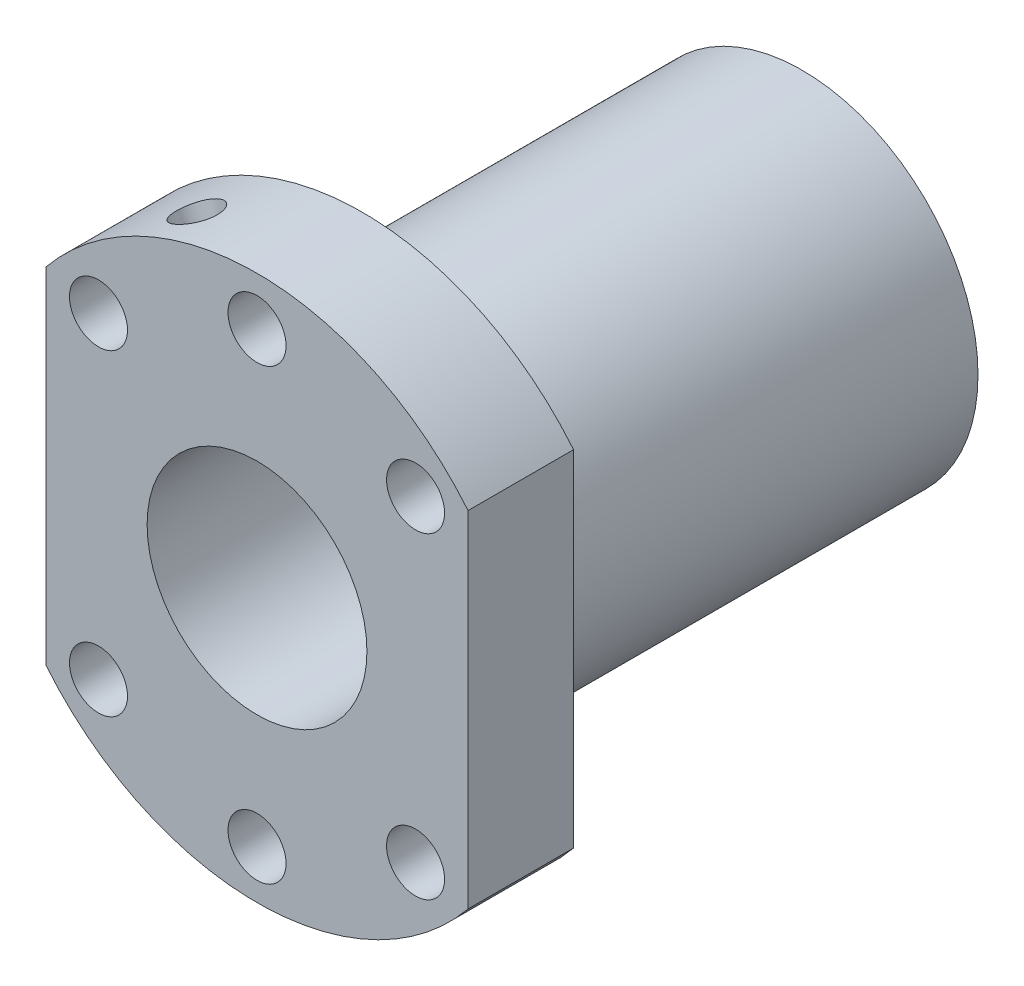
ISO-10303-21;
HEADER;
FILE_DESCRIPTION(('STEP AP214'),'2;1');
FILE_NAME('part.step','',(''),(''),'','','');
FILE_SCHEMA(('AUTOMOTIVE_DESIGN { 1 0 10303 214 1 1 1 1 }'));
ENDSEC;
DATA;
#1=APPLICATION_CONTEXT('core data for automotive mechanical design processes');
#2=APPLICATION_PROTOCOL_DEFINITION('international standard','automotive_design',2000,#1);
#3=PRODUCT_CONTEXT('',#1,'mechanical');
#4=PRODUCT('Part','Part','',(#3));
#5=PRODUCT_RELATED_PRODUCT_CATEGORY('part','',(#4));
#6=PRODUCT_DEFINITION_FORMATION('','',#4);
#7=PRODUCT_DEFINITION_CONTEXT('part definition',#1,'design');
#8=PRODUCT_DEFINITION('design','',#6,#7);
#9=PRODUCT_DEFINITION_SHAPE('','',#8);
#10=(LENGTH_UNIT() NAMED_UNIT(*) SI_UNIT(.MILLI.,.METRE.));
#11=(NAMED_UNIT(*) PLANE_ANGLE_UNIT() SI_UNIT($,.RADIAN.));
#12=(NAMED_UNIT(*) SI_UNIT($,.STERADIAN.) SOLID_ANGLE_UNIT());
#13=UNCERTAINTY_MEASURE_WITH_UNIT(LENGTH_MEASURE(1.E-05),#10,'distance_accuracy_value','');
#14=(GEOMETRIC_REPRESENTATION_CONTEXT(3) GLOBAL_UNCERTAINTY_ASSIGNED_CONTEXT((#13)) GLOBAL_UNIT_ASSIGNED_CONTEXT((#10,
#11,#12)) REPRESENTATION_CONTEXT('',''));
#15=CARTESIAN_POINT('',(0.,0.,0.));
#16=DIRECTION('',(0.,0.,1.));
#17=DIRECTION('',(1.,0.,0.));
#18=AXIS2_PLACEMENT_3D('',#15,#16,#17);
#19=CARTESIAN_POINT('',(0.,0.,12.));
#20=DIRECTION('',(0.,0.,-1.));
#21=DIRECTION('',(-1.,0.,0.));
#22=AXIS2_PLACEMENT_3D('',#19,#20,#21);
#23=CYLINDRICAL_SURFACE('',#22,31.);
#24=DIRECTION('',(0.,0.,-1.));
#25=VECTOR('',#24,1.);
#26=CARTESIAN_POINT('',(24.,-19.6214168703486,12.));
#27=LINE('',#26,#25);
#28=CARTESIAN_POINT('',(24.,-19.6214168703486,12.));
#29=VERTEX_POINT('',#28);
#30=CARTESIAN_POINT('',(24.,-19.6214168703486,0.));
#31=VERTEX_POINT('',#30);
#32=EDGE_CURVE('E35',#29,#31,#27,.T.);
#33=ORIENTED_EDGE('',*,*,#32,.F.);
#34=CARTESIAN_POINT('',(0.,0.,12.));
#35=DIRECTION('',(0.,0.,1.));
#36=DIRECTION('',(1.,0.,0.));
#37=AXIS2_PLACEMENT_3D('',#34,#35,#36);
#38=CIRCLE('',#37,31.);
#39=CARTESIAN_POINT('',(-24.,-19.6214168703486,12.));
#40=VERTEX_POINT('',#39);
#41=EDGE_CURVE('E82',#40,#29,#38,.T.);
#42=ORIENTED_EDGE('',*,*,#41,.F.);
#43=DIRECTION('',(0.,0.,-1.));
#44=VECTOR('',#43,1.);
#45=CARTESIAN_POINT('',(-24.,-19.6214168703486,12.));
#46=LINE('',#45,#44);
#47=CARTESIAN_POINT('',(-24.,-19.6214168703486,0.));
#48=VERTEX_POINT('',#47);
#49=EDGE_CURVE('E62',#48,#40,#46,.F.);
#50=ORIENTED_EDGE('',*,*,#49,.F.);
#51=CARTESIAN_POINT('',(0.,0.,0.));
#52=DIRECTION('',(0.,0.,1.));
#53=DIRECTION('',(1.,0.,0.));
#54=AXIS2_PLACEMENT_3D('',#51,#52,#53);
#55=CIRCLE('',#54,31.);
#56=EDGE_CURVE('E88',#48,#31,#55,.T.);
#57=ORIENTED_EDGE('',*,*,#56,.T.);
#58=EDGE_LOOP('',(#33,#42,#50,#57));
#59=FACE_BOUND('',#58,.T.);
#60=ADVANCED_FACE('F17',(#59),#23,.T.);
#61=CARTESIAN_POINT('',(-14.1342452713024,27.5902720285731,7.));
#62=CARTESIAN_POINT('',(-14.1342401201163,27.5902756123323,6.85981909369858));
#63=CARTESIAN_POINT('',(-14.1236846997904,27.595690019317,6.71954235921639));
#64=CARTESIAN_POINT('',(-14.0817015214886,27.6171362826384,6.44286901789629));
#65=CARTESIAN_POINT('',(-14.050250019881,27.6331802169509,6.30647700923097));
#66=CARTESIAN_POINT('',(-13.9672987475467,27.6752003512647,6.04162039436832));
#67=CARTESIAN_POINT('',(-13.9158102289747,27.701170976605,5.91315138569053));
#68=CARTESIAN_POINT('',(-13.7941280432392,27.7619638154555,5.66772065220375));
#69=CARTESIAN_POINT('',(-13.7239384161053,27.7967841170815,5.55075644945705));
#70=CARTESIAN_POINT('',(-13.5664921381212,27.8739658338832,5.3313422891408));
#71=CARTESIAN_POINT('',(-13.479199313163,27.916343215286,5.22892390273656));
#72=CARTESIAN_POINT('',(-13.2899131164381,28.0069490675099,5.04177976706672));
#73=CARTESIAN_POINT('',(-13.1879191070185,28.0551777921142,4.95705478562994));
#74=CARTESIAN_POINT('',(-12.9717778155538,28.1557664882156,4.80759831042213));
#75=CARTESIAN_POINT('',(-12.8576142864007,28.2081319577819,4.74289400666314));
#76=CARTESIAN_POINT('',(-12.6203299707633,28.3150876641874,4.63548953637274));
#77=CARTESIAN_POINT('',(-12.4972093322438,28.3696778642692,4.59278900644936));
#78=CARTESIAN_POINT('',(-12.2456856516657,28.4791492823758,4.53069472713347));
#79=CARTESIAN_POINT('',(-12.1172947878084,28.534029599499,4.51125006429122));
#80=CARTESIAN_POINT('',(-11.8585876275347,28.6425133390686,4.49606211362361));
#81=CARTESIAN_POINT('',(-11.7282713649218,28.6961167838894,4.50031841018325));
#82=CARTESIAN_POINT('',(-11.4697438954012,28.8004230081387,4.53236987047806));
#83=CARTESIAN_POINT('',(-11.3415284986412,28.8511322419225,4.5601102827327));
#84=CARTESIAN_POINT('',(-11.0905932573533,28.948520988238,4.63825741639545));
#85=CARTESIAN_POINT('',(-10.967873462302,28.9952004644934,4.68866434182462));
#86=CARTESIAN_POINT('',(-10.7313724629871,29.0835626622971,4.8107747981292));
#87=CARTESIAN_POINT('',(-10.6176017607656,29.1252395424297,4.88250289208644));
#88=CARTESIAN_POINT('',(-10.4025107097974,29.2027543518807,5.04520174999892));
#89=CARTESIAN_POINT('',(-10.3011905973662,29.2385921703764,5.13617287910315));
#90=CARTESIAN_POINT('',(-10.1137559728046,29.303956089406,5.33508414715785));
#91=CARTESIAN_POINT('',(-10.0276855668488,29.3334639322324,5.44307185388159));
#92=CARTESIAN_POINT('',(-9.87372356907663,29.3856463677654,5.67278500355847));
#93=CARTESIAN_POINT('',(-9.80583199090228,29.4083209553441,5.79451045682076));
#94=CARTESIAN_POINT('',(-9.69031972928192,29.446585960799,6.04827681879972));
#95=CARTESIAN_POINT('',(-9.64270132417015,29.4621755824679,6.18031888494275));
#96=CARTESIAN_POINT('',(-9.56924444865255,29.4861165018025,6.45095459564243));
#97=CARTESIAN_POINT('',(-9.54340554979036,29.4944679418612,6.58954811125934));
#98=CARTESIAN_POINT('',(-9.51436937092276,29.5038474158376,6.86893504254676));
#99=CARTESIAN_POINT('',(-9.51110858051684,29.5048959921714,7.00972117003471));
#100=CARTESIAN_POINT('',(-9.52716389436612,29.4997155327458,7.28986375447758));
#101=CARTESIAN_POINT('',(-9.54647980159971,29.4934865604959,7.42922022389808));
#102=CARTESIAN_POINT('',(-9.60703431751324,29.4738170655066,7.70235707234798));
#103=CARTESIAN_POINT('',(-9.6482434031063,29.4603862542652,7.83614469961913));
#104=CARTESIAN_POINT('',(-9.75127623529389,29.426442814925,8.09457053516938));
#105=CARTESIAN_POINT('',(-9.81310029199487,29.4059300802942,8.21920860577931));
#106=CARTESIAN_POINT('',(-9.95561696836713,29.357985869995,8.45610195867316));
#107=CARTESIAN_POINT('',(-10.0363512816118,29.3305390954037,8.56832906032629));
#108=CARTESIAN_POINT('',(-10.2141564349569,29.2690934737102,8.77693007887926));
#109=CARTESIAN_POINT('',(-10.3112275384941,29.2350945209504,8.87330374008704));
#110=CARTESIAN_POINT('',(-10.5190372809147,29.1609675681195,9.04768895567128));
#111=CARTESIAN_POINT('',(-10.629807167144,29.1208255040326,9.12565730422603));
#112=CARTESIAN_POINT('',(-10.8615354789183,29.0351904468265,9.26072232651106));
#113=CARTESIAN_POINT('',(-10.982493808206,28.989697504259,9.31781919740132));
#114=CARTESIAN_POINT('',(-11.2308826734606,28.8943754808371,9.40944615389299));
#115=CARTESIAN_POINT('',(-11.3583053257544,28.8445516312855,9.44400304781427));
#116=CARTESIAN_POINT('',(-11.6160383838689,28.7417273864918,9.48965674220853));
#117=CARTESIAN_POINT('',(-11.7463487388027,28.6887270471978,9.50075395575541));
#118=CARTESIAN_POINT('',(-12.0057354175071,28.5811472182681,9.49916859432798));
#119=CARTESIAN_POINT('',(-12.1348141934104,28.5265726352522,9.48655339321283));
#120=CARTESIAN_POINT('',(-12.3884784390329,28.4173306245737,9.43804168387121));
#121=CARTESIAN_POINT('',(-12.5130639023401,28.3626631967789,9.40214514242378));
#122=CARTESIAN_POINT('',(-12.7543005209139,28.2550044971574,9.30810660110948));
#123=CARTESIAN_POINT('',(-12.8709520649513,28.2020131432695,9.24996569216748));
#124=CARTESIAN_POINT('',(-13.0931834167712,28.0995291863662,9.11309669233372));
#125=CARTESIAN_POINT('',(-13.1987634157133,28.0500365229479,9.03436895697306));
#126=CARTESIAN_POINT('',(-13.3963369455363,27.9562188150339,8.858308412332));
#127=CARTESIAN_POINT('',(-13.488292942345,27.9119081149812,8.7609258393535));
#128=CARTESIAN_POINT('',(-13.6558932337324,27.8302945402111,8.55040785764802));
#129=CARTESIAN_POINT('',(-13.7315335668014,27.7929933677183,8.43726863409118));
#130=CARTESIAN_POINT('',(-13.8646285290537,27.7268394640028,8.19824268654993));
#131=CARTESIAN_POINT('',(-13.9220505495098,27.6980018885004,8.07233363147814));
#132=CARTESIAN_POINT('',(-14.0169804119122,27.6500834355439,7.81159123745397));
#133=CARTESIAN_POINT('',(-14.0545112117696,27.630991311096,7.67676838968557));
#134=CARTESIAN_POINT('',(-14.0991155194328,27.6082469797282,7.4509547811725));
#135=CARTESIAN_POINT('',(-14.1122732114442,27.6015188639259,7.36141747228279));
#136=CARTESIAN_POINT('',(-14.1298397421072,27.5925302351152,7.1812667991351));
#137=CARTESIAN_POINT('',(-14.1342486025173,27.5902697109959,7.09065343755384));
#138=CARTESIAN_POINT('',(-14.1342452713024,27.5902720285731,7.));
#139=B_SPLINE_CURVE_WITH_KNOTS('',3,(#61,#62,#63,#64,#65,#66,#67,#68,#69,#70,#71,#72,#73,#74,
#75,#76,#77,#78,#79,#80,#81,#82,#83,#84,#85,#86,#87,#88,#89,#90,#91,#92,#93,#94,#95,#96,#97,#98,
#99,#100,#101,#102,#103,#104,#105,#106,#107,#108,#109,#110,#111,#112,#113,#114,#115,#116,#117,
#118,#119,#120,#121,#122,#123,#124,#125,#126,#127,#128,#129,#130,#131,#132,#133,#134,#135,#136,
#137,#138),.UNSPECIFIED.,.T.,.F.,(4,2,2,2,2,2,2,2,2,2,2,2,2,2,2,2,2,2,2,2,2,2,2,2,2,2,2,2,2,2,2,
2,2,2,2,2,2,2,4),(0.,0.420211733760468,0.840901760810246,1.26135588177584,1.68171924492903,
2.1029814866362,2.5242620057811,2.94611217842449,3.36795538399598,3.78887335900965,
4.20978395291821,4.62971591886167,5.04965166468437,5.47007308555839,5.8905024849154,
6.3121287026456,6.73375523677673,7.15542914152699,7.57709475072284,7.99757376491254,
8.4180491097067,8.83795887477871,9.25787495674499,9.67872573792308,10.0995833061237,
10.5214192107358,10.9432511304216,11.3645804175529,11.7859022859311,12.2060288656642,
12.626156044892,13.0462626225696,13.4663619455548,13.8875979382243,14.3089360938687,
14.7310241975361,15.1526240717025,15.424371015779,15.6961172840185),.UNSPECIFIED.);
#140=CARTESIAN_POINT('',(-14.1342452713024,27.5902720285731,7.));
#141=VERTEX_POINT('',#140);
#142=EDGE_CURVE('E11',#141,#141,#139,.T.);
#143=ORIENTED_EDGE('',*,*,#142,.T.);
#144=EDGE_LOOP('',(#143));
#145=FACE_BOUND('',#144,.T.);
#146=DIRECTION('',(0.,0.,-1.));
#147=VECTOR('',#146,1.);
#148=CARTESIAN_POINT('',(24.,19.6214168703486,12.));
#149=LINE('',#148,#147);
#150=CARTESIAN_POINT('',(24.,19.6214168703486,0.));
#151=VERTEX_POINT('',#150);
#152=CARTESIAN_POINT('',(24.,19.6214168703486,12.));
#153=VERTEX_POINT('',#152);
#154=EDGE_CURVE('E77',#151,#153,#149,.F.);
#155=ORIENTED_EDGE('',*,*,#154,.F.);
#156=CARTESIAN_POINT('',(-24.,19.6214168703486,0.));
#157=VERTEX_POINT('',#156);
#158=EDGE_CURVE('E76',#151,#157,#55,.T.);
#159=ORIENTED_EDGE('',*,*,#158,.T.);
#160=DIRECTION('',(0.,0.,-1.));
#161=VECTOR('',#160,1.);
#162=CARTESIAN_POINT('',(-24.,19.6214168703486,12.));
#163=LINE('',#162,#161);
#164=CARTESIAN_POINT('',(-24.,19.6214168703486,12.));
#165=VERTEX_POINT('',#164);
#166=EDGE_CURVE('E43',#165,#157,#163,.T.);
#167=ORIENTED_EDGE('',*,*,#166,.F.);
#168=EDGE_CURVE('E74',#153,#165,#38,.T.);
#169=ORIENTED_EDGE('',*,*,#168,.F.);
#170=EDGE_LOOP('',(#155,#159,#167,#169));
#171=FACE_BOUND('',#170,.T.);
#172=ADVANCED_FACE('F73',(#145,#171),#23,.T.);
#173=CARTESIAN_POINT('',(0.,0.,12.));
#174=DIRECTION('',(0.,0.,1.));
#175=DIRECTION('',(1.,0.,0.));
#176=AXIS2_PLACEMENT_3D('',#173,#174,#175);
#177=PLANE('',#176);
#178=CARTESIAN_POINT('',(18.0312229202568,-18.0312229202571,12.));
#179=DIRECTION('',(0.,0.,1.));
#180=DIRECTION('',(1.,0.,0.));
#181=AXIS2_PLACEMENT_3D('',#178,#179,#180);
#182=CIRCLE('',#181,3.3);
#183=CARTESIAN_POINT('',(21.3312229202568,-18.0312229202571,12.));
#184=VERTEX_POINT('',#183);
#185=EDGE_CURVE('E117',#184,#184,#182,.T.);
#186=ORIENTED_EDGE('',*,*,#185,.F.);
#187=EDGE_LOOP('',(#186));
#188=FACE_BOUND('',#187,.T.);
#189=CARTESIAN_POINT('',(-18.0312229202568,-18.0312229202571,12.));
#190=DIRECTION('',(0.,0.,1.));
#191=DIRECTION('',(1.,0.,0.));
#192=AXIS2_PLACEMENT_3D('',#189,#190,#191);
#193=CIRCLE('',#192,3.3);
#194=CARTESIAN_POINT('',(-14.7312229202568,-18.0312229202571,12.));
#195=VERTEX_POINT('',#194);
#196=EDGE_CURVE('E114',#195,#195,#193,.T.);
#197=ORIENTED_EDGE('',*,*,#196,.F.);
#198=EDGE_LOOP('',(#197));
#199=FACE_BOUND('',#198,.T.);
#200=CARTESIAN_POINT('',(-18.0312229202568,18.0312229202571,12.));
#201=DIRECTION('',(0.,0.,1.));
#202=DIRECTION('',(1.,0.,0.));
#203=AXIS2_PLACEMENT_3D('',#200,#201,#202);
#204=CIRCLE('',#203,3.3);
#205=CARTESIAN_POINT('',(-14.7312229202568,18.0312229202571,12.));
#206=VERTEX_POINT('',#205);
#207=EDGE_CURVE('E111',#206,#206,#204,.T.);
#208=ORIENTED_EDGE('',*,*,#207,.F.);
#209=EDGE_LOOP('',(#208));
#210=FACE_BOUND('',#209,.T.);
#211=CARTESIAN_POINT('',(18.0312229202568,18.0312229202571,12.));
#212=DIRECTION('',(0.,0.,1.));
#213=DIRECTION('',(1.,0.,0.));
#214=AXIS2_PLACEMENT_3D('',#211,#212,#213);
#215=CIRCLE('',#214,3.3);
#216=CARTESIAN_POINT('',(21.3312229202568,18.0312229202571,12.));
#217=VERTEX_POINT('',#216);
#218=EDGE_CURVE('E107',#217,#217,#215,.T.);
#219=ORIENTED_EDGE('',*,*,#218,.F.);
#220=EDGE_LOOP('',(#219));
#221=FACE_BOUND('',#220,.T.);
#222=CARTESIAN_POINT('',(0.,-25.5,12.));
#223=DIRECTION('',(0.,0.,1.));
#224=DIRECTION('',(1.,0.,0.));
#225=AXIS2_PLACEMENT_3D('',#222,#223,#224);
#226=CIRCLE('',#225,3.3);
#227=CARTESIAN_POINT('',(3.30000000000001,-25.5,12.));
#228=VERTEX_POINT('',#227);
#229=EDGE_CURVE('E103',#228,#228,#226,.T.);
#230=ORIENTED_EDGE('',*,*,#229,.F.);
#231=EDGE_LOOP('',(#230));
#232=FACE_BOUND('',#231,.T.);
#233=CARTESIAN_POINT('',(0.,25.5,12.));
#234=DIRECTION('',(0.,0.,1.));
#235=DIRECTION('',(1.,0.,0.));
#236=AXIS2_PLACEMENT_3D('',#233,#234,#235);
#237=CIRCLE('',#236,3.3);
#238=CARTESIAN_POINT('',(3.30000000000001,25.5,12.));
#239=VERTEX_POINT('',#238);
#240=EDGE_CURVE('E99',#239,#239,#237,.T.);
#241=ORIENTED_EDGE('',*,*,#240,.F.);
#242=EDGE_LOOP('',(#241));
#243=FACE_BOUND('',#242,.T.);
#244=CARTESIAN_POINT('',(0.,0.,12.));
#245=DIRECTION('',(0.,0.,1.));
#246=DIRECTION('',(1.,0.,0.));
#247=AXIS2_PLACEMENT_3D('',#244,#245,#246);
#248=CIRCLE('',#247,12.5);
#249=CARTESIAN_POINT('',(12.5,0.,12.));
#250=VERTEX_POINT('',#249);
#251=EDGE_CURVE('E98',#250,#250,#248,.T.);
#252=ORIENTED_EDGE('',*,*,#251,.F.);
#253=EDGE_LOOP('',(#252));
#254=FACE_BOUND('',#253,.T.);
#255=ORIENTED_EDGE('',*,*,#41,.T.);
#256=DIRECTION('',(0.,1.,0.));
#257=VECTOR('',#256,1.);
#258=CARTESIAN_POINT('',(24.,-35.,12.));
#259=LINE('',#258,#257);
#260=EDGE_CURVE('E67',#29,#153,#259,.T.);
#261=ORIENTED_EDGE('',*,*,#260,.T.);
#262=ORIENTED_EDGE('',*,*,#168,.T.);
#263=DIRECTION('',(0.,-1.,0.));
#264=VECTOR('',#263,1.);
#265=CARTESIAN_POINT('',(-24.,-35.,12.));
#266=LINE('',#265,#264);
#267=EDGE_CURVE('E59',#165,#40,#266,.T.);
#268=ORIENTED_EDGE('',*,*,#267,.T.);
#269=EDGE_LOOP('',(#255,#261,#262,#268));
#270=FACE_BOUND('',#269,.T.);
#271=ADVANCED_FACE('F80',(#188,#199,#210,#221,#232,#243,#254,#270),#177,.T.);
#272=CARTESIAN_POINT('',(0.,0.,0.));
#273=DIRECTION('',(0.,0.,1.));
#274=DIRECTION('',(1.,0.,0.));
#275=AXIS2_PLACEMENT_3D('',#272,#273,#274);
#276=PLANE('',#275);
#277=CARTESIAN_POINT('',(18.0312229202568,-18.0312229202571,0.));
#278=DIRECTION('',(0.,0.,1.));
#279=DIRECTION('',(1.,0.,0.));
#280=AXIS2_PLACEMENT_3D('',#277,#278,#279);
#281=CIRCLE('',#280,3.3);
#282=CARTESIAN_POINT('',(21.3312229202568,-18.0312229202571,0.));
#283=VERTEX_POINT('',#282);
#284=EDGE_CURVE('E115',#283,#283,#281,.T.);
#285=ORIENTED_EDGE('',*,*,#284,.T.);
#286=EDGE_LOOP('',(#285));
#287=FACE_BOUND('',#286,.T.);
#288=CARTESIAN_POINT('',(-18.0312229202568,-18.0312229202571,0.));
#289=DIRECTION('',(0.,0.,1.));
#290=DIRECTION('',(1.,0.,0.));
#291=AXIS2_PLACEMENT_3D('',#288,#289,#290);
#292=CIRCLE('',#291,3.3);
#293=CARTESIAN_POINT('',(-14.7312229202568,-18.0312229202571,0.));
#294=VERTEX_POINT('',#293);
#295=EDGE_CURVE('E112',#294,#294,#292,.T.);
#296=ORIENTED_EDGE('',*,*,#295,.T.);
#297=EDGE_LOOP('',(#296));
#298=FACE_BOUND('',#297,.T.);
#299=CARTESIAN_POINT('',(-18.0312229202568,18.0312229202571,0.));
#300=DIRECTION('',(0.,0.,1.));
#301=DIRECTION('',(1.,0.,0.));
#302=AXIS2_PLACEMENT_3D('',#299,#300,#301);
#303=CIRCLE('',#302,3.3);
#304=CARTESIAN_POINT('',(-14.7312229202568,18.0312229202571,0.));
#305=VERTEX_POINT('',#304);
#306=EDGE_CURVE('E108',#305,#305,#303,.T.);
#307=ORIENTED_EDGE('',*,*,#306,.T.);
#308=EDGE_LOOP('',(#307));
#309=FACE_BOUND('',#308,.T.);
#310=CARTESIAN_POINT('',(18.0312229202568,18.0312229202571,0.));
#311=DIRECTION('',(0.,0.,1.));
#312=DIRECTION('',(1.,0.,0.));
#313=AXIS2_PLACEMENT_3D('',#310,#311,#312);
#314=CIRCLE('',#313,3.3);
#315=CARTESIAN_POINT('',(21.3312229202568,18.0312229202571,0.));
#316=VERTEX_POINT('',#315);
#317=EDGE_CURVE('E104',#316,#316,#314,.T.);
#318=ORIENTED_EDGE('',*,*,#317,.T.);
#319=EDGE_LOOP('',(#318));
#320=FACE_BOUND('',#319,.T.);
#321=CARTESIAN_POINT('',(0.,-25.5,0.));
#322=DIRECTION('',(0.,0.,1.));
#323=DIRECTION('',(1.,0.,0.));
#324=AXIS2_PLACEMENT_3D('',#321,#322,#323);
#325=CIRCLE('',#324,3.3);
#326=CARTESIAN_POINT('',(3.30000000000001,-25.5,0.));
#327=VERTEX_POINT('',#326);
#328=EDGE_CURVE('E100',#327,#327,#325,.T.);
#329=ORIENTED_EDGE('',*,*,#328,.T.);
#330=EDGE_LOOP('',(#329));
#331=FACE_BOUND('',#330,.T.);
#332=CARTESIAN_POINT('',(0.,25.5,0.));
#333=DIRECTION('',(0.,0.,1.));
#334=DIRECTION('',(1.,0.,0.));
#335=AXIS2_PLACEMENT_3D('',#332,#333,#334);
#336=CIRCLE('',#335,3.3);
#337=CARTESIAN_POINT('',(3.30000000000001,25.5,0.));
#338=VERTEX_POINT('',#337);
#339=EDGE_CURVE('E95',#338,#338,#336,.T.);
#340=ORIENTED_EDGE('',*,*,#339,.T.);
#341=EDGE_LOOP('',(#340));
#342=FACE_BOUND('',#341,.T.);
#343=CARTESIAN_POINT('',(0.,0.,0.));
#344=DIRECTION('',(0.,0.,1.));
#345=DIRECTION('',(1.,0.,0.));
#346=AXIS2_PLACEMENT_3D('',#343,#344,#345);
#347=CIRCLE('',#346,20.);
#348=CARTESIAN_POINT('',(20.,0.,0.));
#349=VERTEX_POINT('',#348);
#350=EDGE_CURVE('E91',#349,#349,#347,.T.);
#351=ORIENTED_EDGE('',*,*,#350,.T.);
#352=EDGE_LOOP('',(#351));
#353=FACE_BOUND('',#352,.T.);
#354=DIRECTION('',(0.,1.,0.));
#355=VECTOR('',#354,1.);
#356=CARTESIAN_POINT('',(24.,0.,0.));
#357=LINE('',#356,#355);
#358=EDGE_CURVE('E28',#31,#151,#357,.T.);
#359=ORIENTED_EDGE('',*,*,#358,.F.);
#360=ORIENTED_EDGE('',*,*,#56,.F.);
#361=DIRECTION('',(0.,-1.,0.));
#362=VECTOR('',#361,1.);
#363=CARTESIAN_POINT('',(-24.,0.,0.));
#364=LINE('',#363,#362);
#365=EDGE_CURVE('E81',#157,#48,#364,.T.);
#366=ORIENTED_EDGE('',*,*,#365,.F.);
#367=ORIENTED_EDGE('',*,*,#158,.F.);
#368=EDGE_LOOP('',(#359,#360,#366,#367));
#369=FACE_BOUND('',#368,.T.);
#370=ADVANCED_FACE('F153',(#287,#298,#309,#320,#331,#342,#353,#369),#276,.F.);
#371=CARTESIAN_POINT('',(-24.,-35.,0.));
#372=DIRECTION('',(-1.,0.,0.));
#373=DIRECTION('',(0.,0.,1.));
#374=AXIS2_PLACEMENT_3D('',#371,#372,#373);
#375=PLANE('',#374);
#376=ORIENTED_EDGE('',*,*,#166,.T.);
#377=ORIENTED_EDGE('',*,*,#365,.T.);
#378=ORIENTED_EDGE('',*,*,#49,.T.);
#379=ORIENTED_EDGE('',*,*,#267,.F.);
#380=EDGE_LOOP('',(#376,#377,#378,#379));
#381=FACE_BOUND('',#380,.T.);
#382=ADVANCED_FACE('F60',(#381),#375,.T.);
#383=CARTESIAN_POINT('',(24.,-35.,0.));
#384=DIRECTION('',(1.,0.,0.));
#385=DIRECTION('',(0.,0.,-1.));
#386=AXIS2_PLACEMENT_3D('',#383,#384,#385);
#387=PLANE('',#386);
#388=ORIENTED_EDGE('',*,*,#32,.T.);
#389=ORIENTED_EDGE('',*,*,#358,.T.);
#390=ORIENTED_EDGE('',*,*,#154,.T.);
#391=ORIENTED_EDGE('',*,*,#260,.F.);
#392=EDGE_LOOP('',(#388,#389,#390,#391));
#393=FACE_BOUND('',#392,.T.);
#394=ADVANCED_FACE('F154',(#393),#387,.T.);
#395=CARTESIAN_POINT('',(0.,0.,-50.));
#396=DIRECTION('',(0.,0.,1.));
#397=DIRECTION('',(1.,0.,0.));
#398=AXIS2_PLACEMENT_3D('',#395,#396,#397);
#399=CYLINDRICAL_SURFACE('',#398,20.);
#400=CARTESIAN_POINT('',(0.,0.,-50.));
#401=DIRECTION('',(0.,0.,1.));
#402=DIRECTION('',(1.,0.,0.));
#403=AXIS2_PLACEMENT_3D('',#400,#401,#402);
#404=CIRCLE('',#403,20.);
#405=CARTESIAN_POINT('',(20.,0.,-50.));
#406=VERTEX_POINT('',#405);
#407=EDGE_CURVE('E94',#406,#406,#404,.T.);
#408=ORIENTED_EDGE('',*,*,#407,.T.);
#409=EDGE_LOOP('',(#408));
#410=FACE_BOUND('',#409,.T.);
#411=ORIENTED_EDGE('',*,*,#350,.F.);
#412=EDGE_LOOP('',(#411));
#413=FACE_BOUND('',#412,.T.);
#414=ADVANCED_FACE('F156',(#410,#413),#399,.T.);
#415=CARTESIAN_POINT('',(0.,0.,-50.));
#416=DIRECTION('',(0.,0.,1.));
#417=DIRECTION('',(1.,0.,0.));
#418=AXIS2_PLACEMENT_3D('',#415,#416,#417);
#419=PLANE('',#418);
#420=CARTESIAN_POINT('',(0.,0.,-50.));
#421=DIRECTION('',(0.,0.,1.));
#422=DIRECTION('',(1.,0.,0.));
#423=AXIS2_PLACEMENT_3D('',#420,#421,#422);
#424=CIRCLE('',#423,12.5);
#425=CARTESIAN_POINT('',(12.5,0.,-50.));
#426=VERTEX_POINT('',#425);
#427=EDGE_CURVE('E141',#426,#426,#424,.T.);
#428=ORIENTED_EDGE('',*,*,#427,.T.);
#429=EDGE_LOOP('',(#428));
#430=FACE_BOUND('',#429,.T.);
#431=ORIENTED_EDGE('',*,*,#407,.F.);
#432=EDGE_LOOP('',(#431));
#433=FACE_BOUND('',#432,.T.);
#434=ADVANCED_FACE('F163',(#430,#433),#419,.F.);
#435=CARTESIAN_POINT('',(0.,0.,-50.));
#436=DIRECTION('',(0.,0.,1.));
#437=DIRECTION('',(1.,0.,0.));
#438=AXIS2_PLACEMENT_3D('',#435,#436,#437);
#439=CYLINDRICAL_SURFACE('',#438,12.5);
#440=CARTESIAN_POINT('',(-6.99659451396103,10.3584586308587,7.));
#441=CARTESIAN_POINT('',(-6.9965908264276,10.3584631475819,7.13891093872789));
#442=CARTESIAN_POINT('',(-6.98677596805598,10.3651114328753,7.27788655833335));
#443=CARTESIAN_POINT('',(-6.94773172272472,10.3913211937166,7.55190626285783));
#444=CARTESIAN_POINT('',(-6.91848680101493,10.4108930018198,7.68694711158995));
#445=CARTESIAN_POINT('',(-6.8413002730454,10.4617747650531,7.94909325838553));
#446=CARTESIAN_POINT('',(-6.79337726274527,10.4930730440788,8.07620630383148));
#447=CARTESIAN_POINT('',(-6.6799068361194,10.5656689790388,8.31918711174239));
#448=CARTESIAN_POINT('',(-6.61436040345755,10.6069660768691,8.43505550134475));
#449=CARTESIAN_POINT('',(-6.46609772215948,10.6980008534303,8.65390250963465));
#450=CARTESIAN_POINT('',(-6.38317421401223,10.7478389593839,8.75669896970993));
#451=CARTESIAN_POINT('',(-6.20246322888649,10.8531269949849,8.94489383394746));
#452=CARTESIAN_POINT('',(-6.10467471081372,10.9085773176018,9.03029101854298));
#453=CARTESIAN_POINT('',(-5.89550537097561,11.0230363641561,9.18197004407115));
#454=CARTESIAN_POINT('',(-5.78401350546645,11.082071891088,9.2480787845416));
#455=CARTESIAN_POINT('',(-5.5508561775278,11.2006732108552,9.35818734262035));
#456=CARTESIAN_POINT('',(-5.42919166865032,11.2602389535229,9.40218922975249));
#457=CARTESIAN_POINT('',(-5.1805794667693,11.3767387592866,9.46626798404907));
#458=CARTESIAN_POINT('',(-5.05372250519838,11.4336971561629,9.48665244392753));
#459=CARTESIAN_POINT('',(-4.79681589895599,11.5438330233417,9.50387737959578));
#460=CARTESIAN_POINT('',(-4.66676656313943,11.5970108574808,9.50072012411453));
#461=CARTESIAN_POINT('',(-4.40915711185856,11.6973578403794,9.47118454946109));
#462=CARTESIAN_POINT('',(-4.28158792195908,11.7446017731357,9.44513755708037));
#463=CARTESIAN_POINT('',(-4.03079778208531,11.8330199031567,9.37108741885277));
#464=CARTESIAN_POINT('',(-3.90757700630052,11.8741938574786,9.32308339452032));
#465=CARTESIAN_POINT('',(-3.66835975092151,11.9502722032983,9.20617489963183));
#466=CARTESIAN_POINT('',(-3.55241369202463,11.9851354492089,9.13714062223778));
#467=CARTESIAN_POINT('',(-3.33204472258438,12.0482628195954,8.9802273069085));
#468=CARTESIAN_POINT('',(-3.22762314006455,12.0765261839515,8.8923461005737));
#469=CARTESIAN_POINT('',(-3.03177666079169,12.1271908414422,8.69841594472881));
#470=CARTESIAN_POINT('',(-2.94061001677792,12.1494813734775,8.59207703317602));
#471=CARTESIAN_POINT('',(-2.77646141541323,12.1880430333062,8.36520889387312));
#472=CARTESIAN_POINT('',(-2.70347980200597,12.2043140472519,8.24467939779201));
#473=CARTESIAN_POINT('',(-2.57809946074623,12.2314163612667,7.99244792044548));
#474=CARTESIAN_POINT('',(-2.52574511672642,12.2422359452452,7.86072258090084));
#475=CARTESIAN_POINT('',(-2.44380928428566,12.2588564609792,7.59007169069002));
#476=CARTESIAN_POINT('',(-2.4142248278634,12.2646580468313,7.45114708095228));
#477=CARTESIAN_POINT('',(-2.3792908387742,12.2714827972633,7.17258785500238));
#478=CARTESIAN_POINT('',(-2.37353527877825,12.272586027864,7.03300606422414));
#479=CARTESIAN_POINT('',(-2.38536850860673,12.2702914482064,6.75487944200078));
#480=CARTESIAN_POINT('',(-2.40295597468839,12.26689389318,6.61633455220283));
#481=CARTESIAN_POINT('',(-2.46050781408016,12.2554779400794,6.3455783992694));
#482=CARTESIAN_POINT('',(-2.50025600036174,12.2475041631995,6.21331914241059));
#483=CARTESIAN_POINT('',(-2.60051985096185,12.2266063566125,5.95734180242814));
#484=CARTESIAN_POINT('',(-2.66103722604571,12.2136819191076,5.8336244239107));
#485=CARTESIAN_POINT('',(-2.80167830983373,12.1821935384673,5.5964672251246));
#486=CARTESIAN_POINT('',(-2.8820472917628,12.1635582841338,5.48318238424793));
#487=CARTESIAN_POINT('',(-3.05933143856162,12.1201815181762,5.27172921999771));
#488=CARTESIAN_POINT('',(-3.1562483063438,12.0954393779869,5.17356245437686));
#489=CARTESIAN_POINT('',(-3.36520209557774,12.0389901092227,4.99359360203605));
#490=CARTESIAN_POINT('',(-3.47744828655455,12.0071818914961,4.91206586337501));
#491=CARTESIAN_POINT('',(-3.71237113638261,11.9366377008944,4.76963529625105));
#492=CARTESIAN_POINT('',(-3.83504735693207,11.897902019057,4.70873160163806));
#493=CARTESIAN_POINT('',(-4.08629993662034,11.8139569932462,4.60967782063343));
#494=CARTESIAN_POINT('',(-4.21483824428662,11.7687862194798,4.57139870443437));
#495=CARTESIAN_POINT('',(-4.47451123983591,11.6725278552105,4.51827188084039));
#496=CARTESIAN_POINT('',(-4.60564561307778,11.6214409781389,4.50342135131081));
#497=CARTESIAN_POINT('',(-4.86426613287226,11.5155592017632,4.49768254759278));
#498=CARTESIAN_POINT('',(-4.99177605525472,11.4608442955315,4.50638179885943));
#499=CARTESIAN_POINT('',(-5.24187632524499,11.3486352898459,4.54658487636957));
#500=CARTESIAN_POINT('',(-5.36446673469065,11.291141225346,4.57808841587033));
#501=CARTESIAN_POINT('',(-5.60121093398305,11.1755878041198,4.66282248022897));
#502=CARTESIAN_POINT('',(-5.71538327106319,11.1175300297844,4.71600344532743));
#503=CARTESIAN_POINT('',(-5.93283859862053,11.0030243774464,4.84253060332778));
#504=CARTESIAN_POINT('',(-6.03612072768822,10.946576627053,4.91587838976126));
#505=CARTESIAN_POINT('',(-6.23104384451287,10.8368270812921,5.08204846765322));
#506=CARTESIAN_POINT('',(-6.32247015273124,10.7835907286234,5.17516584095944));
#507=CARTESIAN_POINT('',(-6.48971188396134,10.6837796615843,5.37762560024692));
#508=CARTESIAN_POINT('',(-6.56552360459856,10.6372065279272,5.48697182369981));
#509=CARTESIAN_POINT('',(-6.70060614835481,10.5526448757532,5.72019829172607));
#510=CARTESIAN_POINT('',(-6.75969000480593,10.5147542302445,5.84422240280313));
#511=CARTESIAN_POINT('',(-6.85883523644206,10.450354169146,6.10233193315025));
#512=CARTESIAN_POINT('',(-6.89891386802307,10.4238344310849,6.23640809671797));
#513=CARTESIAN_POINT('',(-6.95145707378644,10.3888377700517,6.47565613860718));
#514=CARTESIAN_POINT('',(-6.96836015360297,10.3774824647788,6.57946354878489));
#515=CARTESIAN_POINT('',(-6.99093008165427,10.3622913079724,6.78883488637784));
#516=CARTESIAN_POINT('',(-6.9965973172545,10.3584551972082,6.89439875311117));
#517=CARTESIAN_POINT('',(-6.99659451396103,10.3584586308587,7.));
#518=B_SPLINE_CURVE_WITH_KNOTS('',3,(#440,#441,#442,#443,#444,#445,#446,#447,#448,#449,#450,
#451,#452,#453,#454,#455,#456,#457,#458,#459,#460,#461,#462,#463,#464,#465,#466,#467,#468,#469,
#470,#471,#472,#473,#474,#475,#476,#477,#478,#479,#480,#481,#482,#483,#484,#485,#486,#487,#488,
#489,#490,#491,#492,#493,#494,#495,#496,#497,#498,#499,#500,#501,#502,#503,#504,#505,#506,#507,
#508,#509,#510,#511,#512,#513,#514,#515,#516,#517),.UNSPECIFIED.,.T.,.F.,(4,2,2,2,2,2,2,2,2,2,2,
2,2,2,2,2,2,2,2,2,2,2,2,2,2,2,2,2,2,2,2,2,2,2,2,2,2,2,4),(0.,0.416346159673569,
0.833025598210742,1.24929124485146,1.66553366214966,2.08705631371092,2.50860850088555,
2.93383501093626,3.35902170616399,3.77860622207701,4.19815030290621,4.61171974083843,
5.02530572684375,5.44149810555757,5.85773839425165,6.28123366906208,6.704736953068,
7.12914657931941,7.55350087540061,7.97059394511484,8.38766336321054,8.80073354458296,
9.21383775885995,9.63232649436302,10.0508583217552,10.4758150433363,10.9007539157526,
11.3232453394662,11.7456858672907,12.1607754353671,12.5758597841689,12.9900004268863,
13.4041738033671,13.8250288006399,14.2459834722445,14.6714724644902,15.0965743772549,
15.413095090954,15.729604892137),.UNSPECIFIED.);
#519=CARTESIAN_POINT('',(-6.99659451396103,10.3584586308587,7.));
#520=VERTEX_POINT('',#519);
#521=EDGE_CURVE('E123',#520,#520,#518,.T.);
#522=ORIENTED_EDGE('',*,*,#521,.T.);
#523=EDGE_LOOP('',(#522));
#524=FACE_BOUND('',#523,.T.);
#525=ORIENTED_EDGE('',*,*,#427,.F.);
#526=EDGE_LOOP('',(#525));
#527=FACE_BOUND('',#526,.T.);
#528=ORIENTED_EDGE('',*,*,#251,.T.);
#529=EDGE_LOOP('',(#528));
#530=FACE_BOUND('',#529,.T.);
#531=ADVANCED_FACE('F185',(#524,#527,#530),#439,.F.);
#532=CARTESIAN_POINT('',(0.,25.5,-50.));
#533=DIRECTION('',(0.,0.,1.));
#534=DIRECTION('',(1.,0.,0.));
#535=AXIS2_PLACEMENT_3D('',#532,#533,#534);
#536=CYLINDRICAL_SURFACE('',#535,3.3);
#537=ORIENTED_EDGE('',*,*,#240,.T.);
#538=EDGE_LOOP('',(#537));
#539=FACE_BOUND('',#538,.T.);
#540=ORIENTED_EDGE('',*,*,#339,.F.);
#541=EDGE_LOOP('',(#540));
#542=FACE_BOUND('',#541,.T.);
#543=ADVANCED_FACE('F188',(#539,#542),#536,.F.);
#544=CARTESIAN_POINT('',(0.,-25.5,-50.));
#545=DIRECTION('',(0.,0.,1.));
#546=DIRECTION('',(1.,0.,0.));
#547=AXIS2_PLACEMENT_3D('',#544,#545,#546);
#548=CYLINDRICAL_SURFACE('',#547,3.3);
#549=ORIENTED_EDGE('',*,*,#229,.T.);
#550=EDGE_LOOP('',(#549));
#551=FACE_BOUND('',#550,.T.);
#552=ORIENTED_EDGE('',*,*,#328,.F.);
#553=EDGE_LOOP('',(#552));
#554=FACE_BOUND('',#553,.T.);
#555=ADVANCED_FACE('F216',(#551,#554),#548,.F.);
#556=CARTESIAN_POINT('',(18.0312229202568,18.0312229202571,-50.));
#557=DIRECTION('',(0.,0.,1.));
#558=DIRECTION('',(1.,0.,0.));
#559=AXIS2_PLACEMENT_3D('',#556,#557,#558);
#560=CYLINDRICAL_SURFACE('',#559,3.3);
#561=ORIENTED_EDGE('',*,*,#218,.T.);
#562=EDGE_LOOP('',(#561));
#563=FACE_BOUND('',#562,.T.);
#564=ORIENTED_EDGE('',*,*,#317,.F.);
#565=EDGE_LOOP('',(#564));
#566=FACE_BOUND('',#565,.T.);
#567=ADVANCED_FACE('F222',(#563,#566),#560,.F.);
#568=CARTESIAN_POINT('',(-18.0312229202568,18.0312229202571,-50.));
#569=DIRECTION('',(0.,0.,1.));
#570=DIRECTION('',(1.,0.,0.));
#571=AXIS2_PLACEMENT_3D('',#568,#569,#570);
#572=CYLINDRICAL_SURFACE('',#571,3.3);
#573=ORIENTED_EDGE('',*,*,#207,.T.);
#574=EDGE_LOOP('',(#573));
#575=FACE_BOUND('',#574,.T.);
#576=ORIENTED_EDGE('',*,*,#306,.F.);
#577=EDGE_LOOP('',(#576));
#578=FACE_BOUND('',#577,.T.);
#579=ADVANCED_FACE('F229',(#575,#578),#572,.F.);
#580=CARTESIAN_POINT('',(-18.0312229202568,-18.0312229202571,-50.));
#581=DIRECTION('',(0.,0.,1.));
#582=DIRECTION('',(1.,0.,0.));
#583=AXIS2_PLACEMENT_3D('',#580,#581,#582);
#584=CYLINDRICAL_SURFACE('',#583,3.3);
#585=ORIENTED_EDGE('',*,*,#196,.T.);
#586=EDGE_LOOP('',(#585));
#587=FACE_BOUND('',#586,.T.);
#588=ORIENTED_EDGE('',*,*,#295,.F.);
#589=EDGE_LOOP('',(#588));
#590=FACE_BOUND('',#589,.T.);
#591=ADVANCED_FACE('F233',(#587,#590),#584,.F.);
#592=CARTESIAN_POINT('',(18.0312229202568,-18.0312229202571,-50.));
#593=DIRECTION('',(0.,0.,1.));
#594=DIRECTION('',(1.,0.,0.));
#595=AXIS2_PLACEMENT_3D('',#592,#593,#594);
#596=CYLINDRICAL_SURFACE('',#595,3.3);
#597=ORIENTED_EDGE('',*,*,#185,.T.);
#598=EDGE_LOOP('',(#597));
#599=FACE_BOUND('',#598,.T.);
#600=ORIENTED_EDGE('',*,*,#284,.F.);
#601=EDGE_LOOP('',(#600));
#602=FACE_BOUND('',#601,.T.);
#603=ADVANCED_FACE('F182',(#599,#602),#596,.F.);
#604=CARTESIAN_POINT('',(-11.8631863234838,28.6402655409182,7.));
#605=DIRECTION('',(-0.382683429789801,0.923879533578007,0.));
#606=DIRECTION('',(-0.923879533578007,-0.382683429789801,0.));
#607=AXIS2_PLACEMENT_3D('',#604,#605,#606);
#608=CYLINDRICAL_SURFACE('',#607,2.5);
#609=ORIENTED_EDGE('',*,*,#142,.F.);
#610=EDGE_LOOP('',(#609));
#611=FACE_BOUND('',#610,.T.);
#612=ORIENTED_EDGE('',*,*,#521,.F.);
#613=EDGE_LOOP('',(#612));
#614=FACE_BOUND('',#613,.T.);
#615=ADVANCED_FACE('F179',(#611,#614),#608,.F.);
#616=CLOSED_SHELL('',(#60,#172,#271,#370,#382,#394,#414,#434,#531,#543,#555,#567,#579,#591,#603,#615));
#617=MANIFOLD_SOLID_BREP('B1',#616);
#618=ADVANCED_BREP_SHAPE_REPRESENTATION('',(#18,#617),#14);
#619=SHAPE_DEFINITION_REPRESENTATION(#9,#618);
ENDSEC;
END-ISO-10303-21;
